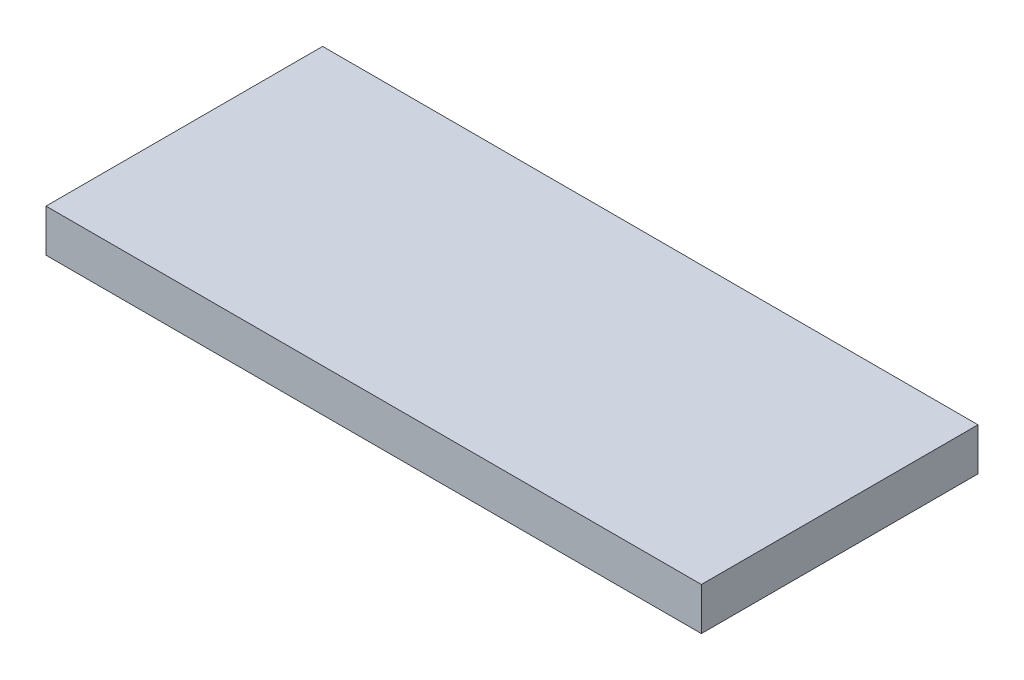
ISO-10303-21;
HEADER;
FILE_DESCRIPTION(('STEP AP214'),'2;1');
FILE_NAME('part.step','',(''),(''),'','','');
FILE_SCHEMA(('AUTOMOTIVE_DESIGN { 1 0 10303 214 1 1 1 1 }'));
ENDSEC;
DATA;
#1=APPLICATION_CONTEXT('core data for automotive mechanical design processes');
#2=APPLICATION_PROTOCOL_DEFINITION('international standard','automotive_design',2000,#1);
#3=PRODUCT_CONTEXT('',#1,'mechanical');
#4=PRODUCT('Part','Part','',(#3));
#5=PRODUCT_RELATED_PRODUCT_CATEGORY('part','',(#4));
#6=PRODUCT_DEFINITION_FORMATION('','',#4);
#7=PRODUCT_DEFINITION_CONTEXT('part definition',#1,'design');
#8=PRODUCT_DEFINITION('design','',#6,#7);
#9=PRODUCT_DEFINITION_SHAPE('','',#8);
#10=(LENGTH_UNIT() NAMED_UNIT(*) SI_UNIT(.MILLI.,.METRE.));
#11=(NAMED_UNIT(*) PLANE_ANGLE_UNIT() SI_UNIT($,.RADIAN.));
#12=(NAMED_UNIT(*) SI_UNIT($,.STERADIAN.) SOLID_ANGLE_UNIT());
#13=UNCERTAINTY_MEASURE_WITH_UNIT(LENGTH_MEASURE(1.E-05),#10,'distance_accuracy_value','');
#14=(GEOMETRIC_REPRESENTATION_CONTEXT(3) GLOBAL_UNCERTAINTY_ASSIGNED_CONTEXT((#13)) GLOBAL_UNIT_ASSIGNED_CONTEXT((#10,
#11,#12)) REPRESENTATION_CONTEXT('',''));
#15=CARTESIAN_POINT('',(0.,0.,0.));
#16=DIRECTION('',(0.,0.,1.));
#17=DIRECTION('',(1.,0.,0.));
#18=AXIS2_PLACEMENT_3D('',#15,#16,#17);
#19=CARTESIAN_POINT('',(77.,10.,-32.5));
#20=DIRECTION('',(1.,0.,0.));
#21=DIRECTION('',(0.,0.,-1.));
#22=AXIS2_PLACEMENT_3D('',#19,#20,#21);
#23=PLANE('',#22);
#24=DIRECTION('',(0.,0.,1.));
#25=VECTOR('',#24,1.);
#26=CARTESIAN_POINT('',(77.,0.,-32.5));
#27=LINE('',#26,#25);
#28=CARTESIAN_POINT('',(77.,0.,-32.5));
#29=VERTEX_POINT('',#28);
#30=CARTESIAN_POINT('',(77.,0.,32.5));
#31=VERTEX_POINT('',#30);
#32=EDGE_CURVE('E99',#29,#31,#27,.T.);
#33=ORIENTED_EDGE('',*,*,#32,.F.);
#34=DIRECTION('',(0.,-1.,0.));
#35=VECTOR('',#34,1.);
#36=CARTESIAN_POINT('',(77.,10.,-32.5));
#37=LINE('',#36,#35);
#38=CARTESIAN_POINT('',(77.,10.,-32.5));
#39=VERTEX_POINT('',#38);
#40=EDGE_CURVE('E11',#39,#29,#37,.T.);
#41=ORIENTED_EDGE('',*,*,#40,.F.);
#42=DIRECTION('',(0.,0.,1.));
#43=VECTOR('',#42,1.);
#44=CARTESIAN_POINT('',(77.,10.,-32.5));
#45=LINE('',#44,#43);
#46=CARTESIAN_POINT('',(77.,10.,32.5));
#47=VERTEX_POINT('',#46);
#48=EDGE_CURVE('E94',#39,#47,#45,.T.);
#49=ORIENTED_EDGE('',*,*,#48,.T.);
#50=DIRECTION('',(0.,-1.,0.));
#51=VECTOR('',#50,1.);
#52=CARTESIAN_POINT('',(77.,10.,32.5));
#53=LINE('',#52,#51);
#54=EDGE_CURVE('E37',#47,#31,#53,.T.);
#55=ORIENTED_EDGE('',*,*,#54,.T.);
#56=EDGE_LOOP('',(#33,#41,#49,#55));
#57=FACE_BOUND('',#56,.T.);
#58=ADVANCED_FACE('F34',(#57),#23,.T.);
#59=CARTESIAN_POINT('',(77.,10.,-32.5));
#60=DIRECTION('',(0.,0.,1.));
#61=DIRECTION('',(1.,0.,0.));
#62=AXIS2_PLACEMENT_3D('',#59,#60,#61);
#63=PLANE('',#62);
#64=DIRECTION('',(-1.,0.,0.));
#65=VECTOR('',#64,1.);
#66=CARTESIAN_POINT('',(77.,0.,-32.5));
#67=LINE('',#66,#65);
#68=CARTESIAN_POINT('',(-77.,0.,-32.5));
#69=VERTEX_POINT('',#68);
#70=EDGE_CURVE('E67',#29,#69,#67,.T.);
#71=ORIENTED_EDGE('',*,*,#70,.T.);
#72=DIRECTION('',(0.,-1.,0.));
#73=VECTOR('',#72,1.);
#74=CARTESIAN_POINT('',(-77.,10.,-32.5));
#75=LINE('',#74,#73);
#76=CARTESIAN_POINT('',(-77.,10.,-32.5));
#77=VERTEX_POINT('',#76);
#78=EDGE_CURVE('E43',#77,#69,#75,.T.);
#79=ORIENTED_EDGE('',*,*,#78,.F.);
#80=DIRECTION('',(-1.,0.,0.));
#81=VECTOR('',#80,1.);
#82=CARTESIAN_POINT('',(77.,10.,-32.5));
#83=LINE('',#82,#81);
#84=EDGE_CURVE('E84',#39,#77,#83,.T.);
#85=ORIENTED_EDGE('',*,*,#84,.F.);
#86=ORIENTED_EDGE('',*,*,#40,.T.);
#87=EDGE_LOOP('',(#71,#79,#85,#86));
#88=FACE_BOUND('',#87,.T.);
#89=ADVANCED_FACE('F109',(#88),#63,.F.);
#90=CARTESIAN_POINT('',(-77.,10.,-32.5));
#91=DIRECTION('',(1.,0.,0.));
#92=DIRECTION('',(0.,0.,-1.));
#93=AXIS2_PLACEMENT_3D('',#90,#91,#92);
#94=PLANE('',#93);
#95=DIRECTION('',(0.,0.,1.));
#96=VECTOR('',#95,1.);
#97=CARTESIAN_POINT('',(-77.,0.,-32.5));
#98=LINE('',#97,#96);
#99=CARTESIAN_POINT('',(-77.,0.,32.5));
#100=VERTEX_POINT('',#99);
#101=EDGE_CURVE('E91',#69,#100,#98,.T.);
#102=ORIENTED_EDGE('',*,*,#101,.T.);
#103=DIRECTION('',(0.,-1.,0.));
#104=VECTOR('',#103,1.);
#105=CARTESIAN_POINT('',(-77.,10.,32.5));
#106=LINE('',#105,#104);
#107=CARTESIAN_POINT('',(-77.,10.,32.5));
#108=VERTEX_POINT('',#107);
#109=EDGE_CURVE('E88',#108,#100,#106,.T.);
#110=ORIENTED_EDGE('',*,*,#109,.F.);
#111=DIRECTION('',(0.,0.,1.));
#112=VECTOR('',#111,1.);
#113=CARTESIAN_POINT('',(-77.,10.,-32.5));
#114=LINE('',#113,#112);
#115=EDGE_CURVE('E79',#77,#108,#114,.T.);
#116=ORIENTED_EDGE('',*,*,#115,.F.);
#117=ORIENTED_EDGE('',*,*,#78,.T.);
#118=EDGE_LOOP('',(#102,#110,#116,#117));
#119=FACE_BOUND('',#118,.T.);
#120=ADVANCED_FACE('F89',(#119),#94,.F.);
#121=CARTESIAN_POINT('',(77.,10.,32.5));
#122=DIRECTION('',(0.,0.,1.));
#123=DIRECTION('',(1.,0.,0.));
#124=AXIS2_PLACEMENT_3D('',#121,#122,#123);
#125=PLANE('',#124);
#126=DIRECTION('',(-1.,0.,0.));
#127=VECTOR('',#126,1.);
#128=CARTESIAN_POINT('',(77.,0.,32.5));
#129=LINE('',#128,#127);
#130=EDGE_CURVE('E102',#31,#100,#129,.T.);
#131=ORIENTED_EDGE('',*,*,#130,.F.);
#132=ORIENTED_EDGE('',*,*,#54,.F.);
#133=DIRECTION('',(-1.,0.,0.));
#134=VECTOR('',#133,1.);
#135=CARTESIAN_POINT('',(77.,10.,32.5));
#136=LINE('',#135,#134);
#137=EDGE_CURVE('E83',#47,#108,#136,.T.);
#138=ORIENTED_EDGE('',*,*,#137,.T.);
#139=ORIENTED_EDGE('',*,*,#109,.T.);
#140=EDGE_LOOP('',(#131,#132,#138,#139));
#141=FACE_BOUND('',#140,.T.);
#142=ADVANCED_FACE('F93',(#141),#125,.T.);
#143=CARTESIAN_POINT('',(0.,10.,0.));
#144=DIRECTION('',(0.,-1.,0.));
#145=DIRECTION('',(0.,0.,-1.));
#146=AXIS2_PLACEMENT_3D('',#143,#144,#145);
#147=PLANE('',#146);
#148=ORIENTED_EDGE('',*,*,#48,.F.);
#149=ORIENTED_EDGE('',*,*,#84,.T.);
#150=ORIENTED_EDGE('',*,*,#115,.T.);
#151=ORIENTED_EDGE('',*,*,#137,.F.);
#152=EDGE_LOOP('',(#148,#149,#150,#151));
#153=FACE_BOUND('',#152,.T.);
#154=ADVANCED_FACE('F82',(#153),#147,.F.);
#155=CARTESIAN_POINT('',(0.,0.,0.));
#156=DIRECTION('',(0.,-1.,0.));
#157=DIRECTION('',(0.,0.,-1.));
#158=AXIS2_PLACEMENT_3D('',#155,#156,#157);
#159=PLANE('',#158);
#160=ORIENTED_EDGE('',*,*,#32,.T.);
#161=ORIENTED_EDGE('',*,*,#130,.T.);
#162=ORIENTED_EDGE('',*,*,#101,.F.);
#163=ORIENTED_EDGE('',*,*,#70,.F.);
#164=EDGE_LOOP('',(#160,#161,#162,#163));
#165=FACE_BOUND('',#164,.T.);
#166=ADVANCED_FACE('F107',(#165),#159,.T.);
#167=CLOSED_SHELL('',(#58,#89,#120,#142,#154,#166));
#168=MANIFOLD_SOLID_BREP('B2',#167);
#169=ADVANCED_BREP_SHAPE_REPRESENTATION('',(#18,#168),#14);
#170=SHAPE_DEFINITION_REPRESENTATION(#9,#169);
ENDSEC;
END-ISO-10303-21;
